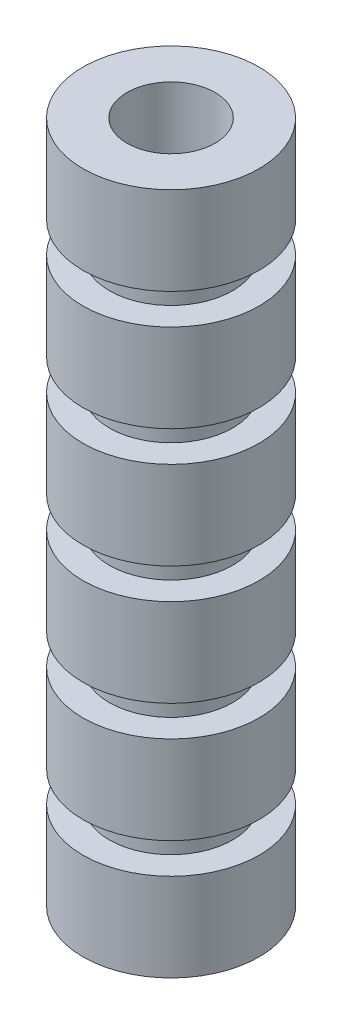
ISO-10303-21;
HEADER;
FILE_DESCRIPTION(('STEP AP214'),'2;1');
FILE_NAME('part.step','',(''),(''),'','','');
FILE_SCHEMA(('AUTOMOTIVE_DESIGN { 1 0 10303 214 1 1 1 1 }'));
ENDSEC;
DATA;
#1=APPLICATION_CONTEXT('core data for automotive mechanical design processes');
#2=APPLICATION_PROTOCOL_DEFINITION('international standard','automotive_design',2000,#1);
#3=PRODUCT_CONTEXT('',#1,'mechanical');
#4=PRODUCT('Part','Part','',(#3));
#5=PRODUCT_RELATED_PRODUCT_CATEGORY('part','',(#4));
#6=PRODUCT_DEFINITION_FORMATION('','',#4);
#7=PRODUCT_DEFINITION_CONTEXT('part definition',#1,'design');
#8=PRODUCT_DEFINITION('design','',#6,#7);
#9=PRODUCT_DEFINITION_SHAPE('','',#8);
#10=(LENGTH_UNIT() NAMED_UNIT(*) SI_UNIT(.MILLI.,.METRE.));
#11=(NAMED_UNIT(*) PLANE_ANGLE_UNIT() SI_UNIT($,.RADIAN.));
#12=(NAMED_UNIT(*) SI_UNIT($,.STERADIAN.) SOLID_ANGLE_UNIT());
#13=UNCERTAINTY_MEASURE_WITH_UNIT(LENGTH_MEASURE(1.E-05),#10,'distance_accuracy_value','');
#14=(GEOMETRIC_REPRESENTATION_CONTEXT(3) GLOBAL_UNCERTAINTY_ASSIGNED_CONTEXT((#13)) GLOBAL_UNIT_ASSIGNED_CONTEXT((#10,
#11,#12)) REPRESENTATION_CONTEXT('',''));
#15=CARTESIAN_POINT('',(0.,0.,0.));
#16=DIRECTION('',(0.,0.,1.));
#17=DIRECTION('',(1.,0.,0.));
#18=AXIS2_PLACEMENT_3D('',#15,#16,#17);
#19=CARTESIAN_POINT('',(0.,64.,0.));
#20=DIRECTION('',(0.,1.,0.));
#21=DIRECTION('',(0.,0.,1.));
#22=AXIS2_PLACEMENT_3D('',#19,#20,#21);
#23=PLANE('',#22);
#24=CARTESIAN_POINT('',(0.,64.,0.));
#25=DIRECTION('',(0.,1.,0.));
#26=DIRECTION('',(0.,0.,1.));
#27=AXIS2_PLACEMENT_3D('',#24,#25,#26);
#28=CIRCLE('',#27,10.);
#29=CARTESIAN_POINT('',(0.,64.,10.));
#30=VERTEX_POINT('',#29);
#31=EDGE_CURVE('E120',#30,#30,#28,.T.);
#32=ORIENTED_EDGE('',*,*,#31,.T.);
#33=EDGE_LOOP('',(#32));
#34=FACE_BOUND('',#33,.T.);
#35=CARTESIAN_POINT('',(0.,64.,0.));
#36=DIRECTION('',(0.,1.,0.));
#37=DIRECTION('',(0.,0.,1.));
#38=AXIS2_PLACEMENT_3D('',#35,#36,#37);
#39=CIRCLE('',#38,7.);
#40=CARTESIAN_POINT('',(0.,64.,7.));
#41=VERTEX_POINT('',#40);
#42=EDGE_CURVE('E132',#41,#41,#39,.T.);
#43=ORIENTED_EDGE('',*,*,#42,.F.);
#44=EDGE_LOOP('',(#43));
#45=FACE_BOUND('',#44,.T.);
#46=ADVANCED_FACE('F49',(#34,#45),#23,.T.);
#47=CARTESIAN_POINT('',(0.,50.5,0.));
#48=DIRECTION('',(0.,1.,0.));
#49=DIRECTION('',(0.,0.,1.));
#50=AXIS2_PLACEMENT_3D('',#47,#48,#49);
#51=PLANE('',#50);
#52=CARTESIAN_POINT('',(0.,50.5,0.));
#53=DIRECTION('',(0.,1.,0.));
#54=DIRECTION('',(0.,0.,1.));
#55=AXIS2_PLACEMENT_3D('',#52,#53,#54);
#56=CIRCLE('',#55,10.);
#57=CARTESIAN_POINT('',(0.,50.5,10.));
#58=VERTEX_POINT('',#57);
#59=EDGE_CURVE('E104',#58,#58,#56,.T.);
#60=ORIENTED_EDGE('',*,*,#59,.T.);
#61=EDGE_LOOP('',(#60));
#62=FACE_BOUND('',#61,.T.);
#63=CARTESIAN_POINT('',(0.,50.5,0.));
#64=DIRECTION('',(0.,1.,0.));
#65=DIRECTION('',(0.,0.,1.));
#66=AXIS2_PLACEMENT_3D('',#63,#64,#65);
#67=CIRCLE('',#66,7.);
#68=CARTESIAN_POINT('',(0.,50.5,7.));
#69=VERTEX_POINT('',#68);
#70=EDGE_CURVE('E116',#69,#69,#67,.T.);
#71=ORIENTED_EDGE('',*,*,#70,.F.);
#72=EDGE_LOOP('',(#71));
#73=FACE_BOUND('',#72,.T.);
#74=ADVANCED_FACE('F172',(#62,#73),#51,.T.);
#75=CARTESIAN_POINT('',(0.,37.,0.));
#76=DIRECTION('',(0.,1.,0.));
#77=DIRECTION('',(0.,0.,1.));
#78=AXIS2_PLACEMENT_3D('',#75,#76,#77);
#79=PLANE('',#78);
#80=CARTESIAN_POINT('',(0.,37.,0.));
#81=DIRECTION('',(0.,1.,0.));
#82=DIRECTION('',(0.,0.,1.));
#83=AXIS2_PLACEMENT_3D('',#80,#81,#82);
#84=CIRCLE('',#83,10.);
#85=CARTESIAN_POINT('',(0.,37.,10.));
#86=VERTEX_POINT('',#85);
#87=EDGE_CURVE('E88',#86,#86,#84,.T.);
#88=ORIENTED_EDGE('',*,*,#87,.T.);
#89=EDGE_LOOP('',(#88));
#90=FACE_BOUND('',#89,.T.);
#91=CARTESIAN_POINT('',(0.,37.,0.));
#92=DIRECTION('',(0.,1.,0.));
#93=DIRECTION('',(0.,0.,1.));
#94=AXIS2_PLACEMENT_3D('',#91,#92,#93);
#95=CIRCLE('',#94,7.);
#96=CARTESIAN_POINT('',(0.,37.,7.));
#97=VERTEX_POINT('',#96);
#98=EDGE_CURVE('E100',#97,#97,#95,.T.);
#99=ORIENTED_EDGE('',*,*,#98,.F.);
#100=EDGE_LOOP('',(#99));
#101=FACE_BOUND('',#100,.T.);
#102=ADVANCED_FACE('F179',(#90,#101),#79,.T.);
#103=CARTESIAN_POINT('',(0.,23.5,0.));
#104=DIRECTION('',(0.,1.,0.));
#105=DIRECTION('',(0.,0.,1.));
#106=AXIS2_PLACEMENT_3D('',#103,#104,#105);
#107=PLANE('',#106);
#108=CARTESIAN_POINT('',(0.,23.5,0.));
#109=DIRECTION('',(0.,1.,0.));
#110=DIRECTION('',(0.,0.,1.));
#111=AXIS2_PLACEMENT_3D('',#108,#109,#110);
#112=CIRCLE('',#111,10.);
#113=CARTESIAN_POINT('',(0.,23.5,10.));
#114=VERTEX_POINT('',#113);
#115=EDGE_CURVE('E72',#114,#114,#112,.T.);
#116=ORIENTED_EDGE('',*,*,#115,.T.);
#117=EDGE_LOOP('',(#116));
#118=FACE_BOUND('',#117,.T.);
#119=CARTESIAN_POINT('',(0.,23.5,0.));
#120=DIRECTION('',(0.,1.,0.));
#121=DIRECTION('',(0.,0.,1.));
#122=AXIS2_PLACEMENT_3D('',#119,#120,#121);
#123=CIRCLE('',#122,7.);
#124=CARTESIAN_POINT('',(0.,23.5,7.));
#125=VERTEX_POINT('',#124);
#126=EDGE_CURVE('E84',#125,#125,#123,.T.);
#127=ORIENTED_EDGE('',*,*,#126,.F.);
#128=EDGE_LOOP('',(#127));
#129=FACE_BOUND('',#128,.T.);
#130=ADVANCED_FACE('F211',(#118,#129),#107,.T.);
#131=CARTESIAN_POINT('',(0.,10.,0.));
#132=DIRECTION('',(0.,1.,0.));
#133=DIRECTION('',(0.,0.,1.));
#134=AXIS2_PLACEMENT_3D('',#131,#132,#133);
#135=PLANE('',#134);
#136=CARTESIAN_POINT('',(0.,10.,0.));
#137=DIRECTION('',(0.,1.,0.));
#138=DIRECTION('',(0.,0.,1.));
#139=AXIS2_PLACEMENT_3D('',#136,#137,#138);
#140=CIRCLE('',#139,10.);
#141=CARTESIAN_POINT('',(0.,10.,10.));
#142=VERTEX_POINT('',#141);
#143=EDGE_CURVE('E10',#142,#142,#140,.T.);
#144=ORIENTED_EDGE('',*,*,#143,.T.);
#145=EDGE_LOOP('',(#144));
#146=FACE_BOUND('',#145,.T.);
#147=CARTESIAN_POINT('',(0.,10.,0.));
#148=DIRECTION('',(0.,1.,0.));
#149=DIRECTION('',(0.,0.,1.));
#150=AXIS2_PLACEMENT_3D('',#147,#148,#149);
#151=CIRCLE('',#150,7.);
#152=CARTESIAN_POINT('',(0.,10.,7.));
#153=VERTEX_POINT('',#152);
#154=EDGE_CURVE('E68',#153,#153,#151,.T.);
#155=ORIENTED_EDGE('',*,*,#154,.F.);
#156=EDGE_LOOP('',(#155));
#157=FACE_BOUND('',#156,.T.);
#158=ADVANCED_FACE('F227',(#146,#157),#135,.T.);
#159=CARTESIAN_POINT('',(0.,0.,0.));
#160=DIRECTION('',(0.,1.,0.));
#161=DIRECTION('',(0.,0.,1.));
#162=AXIS2_PLACEMENT_3D('',#159,#160,#161);
#163=PLANE('',#162);
#164=CARTESIAN_POINT('',(0.,0.,0.));
#165=DIRECTION('',(0.,1.,0.));
#166=DIRECTION('',(0.,0.,1.));
#167=AXIS2_PLACEMENT_3D('',#164,#165,#166);
#168=CIRCLE('',#167,10.);
#169=CARTESIAN_POINT('',(0.,0.,10.));
#170=VERTEX_POINT('',#169);
#171=EDGE_CURVE('E53',#170,#170,#168,.T.);
#172=ORIENTED_EDGE('',*,*,#171,.F.);
#173=EDGE_LOOP('',(#172));
#174=FACE_BOUND('',#173,.T.);
#175=CARTESIAN_POINT('',(0.,0.,0.));
#176=DIRECTION('',(0.,1.,0.));
#177=DIRECTION('',(0.,0.,1.));
#178=AXIS2_PLACEMENT_3D('',#175,#176,#177);
#179=CIRCLE('',#178,5.);
#180=CARTESIAN_POINT('',(0.,0.,5.));
#181=VERTEX_POINT('',#180);
#182=EDGE_CURVE('E62',#181,#181,#179,.T.);
#183=ORIENTED_EDGE('',*,*,#182,.T.);
#184=EDGE_LOOP('',(#183));
#185=FACE_BOUND('',#184,.T.);
#186=ADVANCED_FACE('F243',(#174,#185),#163,.F.);
#187=CARTESIAN_POINT('',(0.,10.,0.));
#188=DIRECTION('',(0.,-1.,0.));
#189=DIRECTION('',(0.,0.,-1.));
#190=AXIS2_PLACEMENT_3D('',#187,#188,#189);
#191=CYLINDRICAL_SURFACE('',#190,10.);
#192=ORIENTED_EDGE('',*,*,#143,.F.);
#193=EDGE_LOOP('',(#192));
#194=FACE_BOUND('',#193,.T.);
#195=ORIENTED_EDGE('',*,*,#171,.T.);
#196=EDGE_LOOP('',(#195));
#197=FACE_BOUND('',#196,.T.);
#198=ADVANCED_FACE('F51',(#194,#197),#191,.T.);
#199=CARTESIAN_POINT('',(0.,10.,0.));
#200=DIRECTION('',(0.,-1.,0.));
#201=DIRECTION('',(0.,0.,-1.));
#202=AXIS2_PLACEMENT_3D('',#199,#200,#201);
#203=CYLINDRICAL_SURFACE('',#202,5.);
#204=ORIENTED_EDGE('',*,*,#182,.F.);
#205=EDGE_LOOP('',(#204));
#206=FACE_BOUND('',#205,.T.);
#207=CARTESIAN_POINT('',(0.,77.5,0.));
#208=DIRECTION('',(0.,1.,0.));
#209=DIRECTION('',(0.,0.,1.));
#210=AXIS2_PLACEMENT_3D('',#207,#208,#209);
#211=CIRCLE('',#210,5.);
#212=CARTESIAN_POINT('',(0.,77.5,5.));
#213=VERTEX_POINT('',#212);
#214=EDGE_CURVE('E144',#213,#213,#211,.T.);
#215=ORIENTED_EDGE('',*,*,#214,.T.);
#216=EDGE_LOOP('',(#215));
#217=FACE_BOUND('',#216,.T.);
#218=ADVANCED_FACE('F152',(#206,#217),#203,.F.);
#219=CARTESIAN_POINT('',(0.,13.5,0.));
#220=DIRECTION('',(0.,-1.,0.));
#221=DIRECTION('',(0.,0.,-1.));
#222=AXIS2_PLACEMENT_3D('',#219,#220,#221);
#223=CYLINDRICAL_SURFACE('',#222,7.);
#224=CARTESIAN_POINT('',(0.,13.5,0.));
#225=DIRECTION('',(0.,1.,0.));
#226=DIRECTION('',(0.,0.,1.));
#227=AXIS2_PLACEMENT_3D('',#224,#225,#226);
#228=CIRCLE('',#227,7.);
#229=CARTESIAN_POINT('',(0.,13.5,7.));
#230=VERTEX_POINT('',#229);
#231=EDGE_CURVE('E67',#230,#230,#228,.T.);
#232=ORIENTED_EDGE('',*,*,#231,.F.);
#233=EDGE_LOOP('',(#232));
#234=FACE_BOUND('',#233,.T.);
#235=ORIENTED_EDGE('',*,*,#154,.T.);
#236=EDGE_LOOP('',(#235));
#237=FACE_BOUND('',#236,.T.);
#238=ADVANCED_FACE('F232',(#234,#237),#223,.T.);
#239=CARTESIAN_POINT('',(0.,13.5,0.));
#240=DIRECTION('',(0.,1.,0.));
#241=DIRECTION('',(0.,0.,1.));
#242=AXIS2_PLACEMENT_3D('',#239,#240,#241);
#243=PLANE('',#242);
#244=ORIENTED_EDGE('',*,*,#231,.T.);
#245=EDGE_LOOP('',(#244));
#246=FACE_BOUND('',#245,.T.);
#247=CARTESIAN_POINT('',(0.,13.5,0.));
#248=DIRECTION('',(0.,1.,0.));
#249=DIRECTION('',(0.,0.,1.));
#250=AXIS2_PLACEMENT_3D('',#247,#248,#249);
#251=CIRCLE('',#250,10.);
#252=CARTESIAN_POINT('',(0.,13.5,10.));
#253=VERTEX_POINT('',#252);
#254=EDGE_CURVE('E76',#253,#253,#251,.T.);
#255=ORIENTED_EDGE('',*,*,#254,.F.);
#256=EDGE_LOOP('',(#255));
#257=FACE_BOUND('',#256,.T.);
#258=ADVANCED_FACE('F229',(#246,#257),#243,.F.);
#259=CARTESIAN_POINT('',(0.,23.5,0.));
#260=DIRECTION('',(0.,-1.,0.));
#261=DIRECTION('',(0.,0.,-1.));
#262=AXIS2_PLACEMENT_3D('',#259,#260,#261);
#263=CYLINDRICAL_SURFACE('',#262,10.);
#264=ORIENTED_EDGE('',*,*,#115,.F.);
#265=EDGE_LOOP('',(#264));
#266=FACE_BOUND('',#265,.T.);
#267=ORIENTED_EDGE('',*,*,#254,.T.);
#268=EDGE_LOOP('',(#267));
#269=FACE_BOUND('',#268,.T.);
#270=ADVANCED_FACE('F223',(#266,#269),#263,.T.);
#271=CARTESIAN_POINT('',(0.,27.,0.));
#272=DIRECTION('',(0.,-1.,0.));
#273=DIRECTION('',(0.,0.,-1.));
#274=AXIS2_PLACEMENT_3D('',#271,#272,#273);
#275=CYLINDRICAL_SURFACE('',#274,7.);
#276=CARTESIAN_POINT('',(0.,27.,0.));
#277=DIRECTION('',(0.,1.,0.));
#278=DIRECTION('',(0.,0.,1.));
#279=AXIS2_PLACEMENT_3D('',#276,#277,#278);
#280=CIRCLE('',#279,7.);
#281=CARTESIAN_POINT('',(0.,27.,7.));
#282=VERTEX_POINT('',#281);
#283=EDGE_CURVE('E80',#282,#282,#280,.T.);
#284=ORIENTED_EDGE('',*,*,#283,.F.);
#285=EDGE_LOOP('',(#284));
#286=FACE_BOUND('',#285,.T.);
#287=ORIENTED_EDGE('',*,*,#126,.T.);
#288=EDGE_LOOP('',(#287));
#289=FACE_BOUND('',#288,.T.);
#290=ADVANCED_FACE('F216',(#286,#289),#275,.T.);
#291=CARTESIAN_POINT('',(0.,27.,0.));
#292=DIRECTION('',(0.,1.,0.));
#293=DIRECTION('',(0.,0.,1.));
#294=AXIS2_PLACEMENT_3D('',#291,#292,#293);
#295=PLANE('',#294);
#296=ORIENTED_EDGE('',*,*,#283,.T.);
#297=EDGE_LOOP('',(#296));
#298=FACE_BOUND('',#297,.T.);
#299=CARTESIAN_POINT('',(0.,27.,0.));
#300=DIRECTION('',(0.,1.,0.));
#301=DIRECTION('',(0.,0.,1.));
#302=AXIS2_PLACEMENT_3D('',#299,#300,#301);
#303=CIRCLE('',#302,10.);
#304=CARTESIAN_POINT('',(0.,27.,10.));
#305=VERTEX_POINT('',#304);
#306=EDGE_CURVE('E92',#305,#305,#303,.T.);
#307=ORIENTED_EDGE('',*,*,#306,.F.);
#308=EDGE_LOOP('',(#307));
#309=FACE_BOUND('',#308,.T.);
#310=ADVANCED_FACE('F213',(#298,#309),#295,.F.);
#311=CARTESIAN_POINT('',(0.,37.,0.));
#312=DIRECTION('',(0.,-1.,0.));
#313=DIRECTION('',(0.,0.,-1.));
#314=AXIS2_PLACEMENT_3D('',#311,#312,#313);
#315=CYLINDRICAL_SURFACE('',#314,10.);
#316=ORIENTED_EDGE('',*,*,#87,.F.);
#317=EDGE_LOOP('',(#316));
#318=FACE_BOUND('',#317,.T.);
#319=ORIENTED_EDGE('',*,*,#306,.T.);
#320=EDGE_LOOP('',(#319));
#321=FACE_BOUND('',#320,.T.);
#322=ADVANCED_FACE('F207',(#318,#321),#315,.T.);
#323=CARTESIAN_POINT('',(0.,40.5,0.));
#324=DIRECTION('',(0.,-1.,0.));
#325=DIRECTION('',(0.,0.,-1.));
#326=AXIS2_PLACEMENT_3D('',#323,#324,#325);
#327=CYLINDRICAL_SURFACE('',#326,7.);
#328=CARTESIAN_POINT('',(0.,40.5,0.));
#329=DIRECTION('',(0.,1.,0.));
#330=DIRECTION('',(0.,0.,1.));
#331=AXIS2_PLACEMENT_3D('',#328,#329,#330);
#332=CIRCLE('',#331,7.);
#333=CARTESIAN_POINT('',(0.,40.5,7.));
#334=VERTEX_POINT('',#333);
#335=EDGE_CURVE('E96',#334,#334,#332,.T.);
#336=ORIENTED_EDGE('',*,*,#335,.F.);
#337=EDGE_LOOP('',(#336));
#338=FACE_BOUND('',#337,.T.);
#339=ORIENTED_EDGE('',*,*,#98,.T.);
#340=EDGE_LOOP('',(#339));
#341=FACE_BOUND('',#340,.T.);
#342=ADVANCED_FACE('F200',(#338,#341),#327,.T.);
#343=CARTESIAN_POINT('',(0.,40.5,0.));
#344=DIRECTION('',(0.,1.,0.));
#345=DIRECTION('',(0.,0.,1.));
#346=AXIS2_PLACEMENT_3D('',#343,#344,#345);
#347=PLANE('',#346);
#348=ORIENTED_EDGE('',*,*,#335,.T.);
#349=EDGE_LOOP('',(#348));
#350=FACE_BOUND('',#349,.T.);
#351=CARTESIAN_POINT('',(0.,40.5,0.));
#352=DIRECTION('',(0.,1.,0.));
#353=DIRECTION('',(0.,0.,1.));
#354=AXIS2_PLACEMENT_3D('',#351,#352,#353);
#355=CIRCLE('',#354,10.);
#356=CARTESIAN_POINT('',(0.,40.5,10.));
#357=VERTEX_POINT('',#356);
#358=EDGE_CURVE('E108',#357,#357,#355,.T.);
#359=ORIENTED_EDGE('',*,*,#358,.F.);
#360=EDGE_LOOP('',(#359));
#361=FACE_BOUND('',#360,.T.);
#362=ADVANCED_FACE('F197',(#350,#361),#347,.F.);
#363=CARTESIAN_POINT('',(0.,50.5,0.));
#364=DIRECTION('',(0.,-1.,0.));
#365=DIRECTION('',(0.,0.,-1.));
#366=AXIS2_PLACEMENT_3D('',#363,#364,#365);
#367=CYLINDRICAL_SURFACE('',#366,10.);
#368=ORIENTED_EDGE('',*,*,#59,.F.);
#369=EDGE_LOOP('',(#368));
#370=FACE_BOUND('',#369,.T.);
#371=ORIENTED_EDGE('',*,*,#358,.T.);
#372=EDGE_LOOP('',(#371));
#373=FACE_BOUND('',#372,.T.);
#374=ADVANCED_FACE('F194',(#370,#373),#367,.T.);
#375=CARTESIAN_POINT('',(0.,54.,0.));
#376=DIRECTION('',(0.,-1.,0.));
#377=DIRECTION('',(0.,0.,-1.));
#378=AXIS2_PLACEMENT_3D('',#375,#376,#377);
#379=CYLINDRICAL_SURFACE('',#378,7.);
#380=CARTESIAN_POINT('',(0.,54.,0.));
#381=DIRECTION('',(0.,1.,0.));
#382=DIRECTION('',(0.,0.,1.));
#383=AXIS2_PLACEMENT_3D('',#380,#381,#382);
#384=CIRCLE('',#383,7.);
#385=CARTESIAN_POINT('',(0.,54.,7.));
#386=VERTEX_POINT('',#385);
#387=EDGE_CURVE('E112',#386,#386,#384,.T.);
#388=ORIENTED_EDGE('',*,*,#387,.F.);
#389=EDGE_LOOP('',(#388));
#390=FACE_BOUND('',#389,.T.);
#391=ORIENTED_EDGE('',*,*,#70,.T.);
#392=EDGE_LOOP('',(#391));
#393=FACE_BOUND('',#392,.T.);
#394=ADVANCED_FACE('F188',(#390,#393),#379,.T.);
#395=CARTESIAN_POINT('',(0.,54.,0.));
#396=DIRECTION('',(0.,1.,0.));
#397=DIRECTION('',(0.,0.,1.));
#398=AXIS2_PLACEMENT_3D('',#395,#396,#397);
#399=PLANE('',#398);
#400=ORIENTED_EDGE('',*,*,#387,.T.);
#401=EDGE_LOOP('',(#400));
#402=FACE_BOUND('',#401,.T.);
#403=CARTESIAN_POINT('',(0.,54.,0.));
#404=DIRECTION('',(0.,1.,0.));
#405=DIRECTION('',(0.,0.,1.));
#406=AXIS2_PLACEMENT_3D('',#403,#404,#405);
#407=CIRCLE('',#406,10.);
#408=CARTESIAN_POINT('',(0.,54.,10.));
#409=VERTEX_POINT('',#408);
#410=EDGE_CURVE('E124',#409,#409,#407,.T.);
#411=ORIENTED_EDGE('',*,*,#410,.F.);
#412=EDGE_LOOP('',(#411));
#413=FACE_BOUND('',#412,.T.);
#414=ADVANCED_FACE('F185',(#402,#413),#399,.F.);
#415=CARTESIAN_POINT('',(0.,64.,0.));
#416=DIRECTION('',(0.,-1.,0.));
#417=DIRECTION('',(0.,0.,-1.));
#418=AXIS2_PLACEMENT_3D('',#415,#416,#417);
#419=CYLINDRICAL_SURFACE('',#418,10.);
#420=ORIENTED_EDGE('',*,*,#31,.F.);
#421=EDGE_LOOP('',(#420));
#422=FACE_BOUND('',#421,.T.);
#423=ORIENTED_EDGE('',*,*,#410,.T.);
#424=EDGE_LOOP('',(#423));
#425=FACE_BOUND('',#424,.T.);
#426=ADVANCED_FACE('F168',(#422,#425),#419,.T.);
#427=CARTESIAN_POINT('',(0.,67.5,0.));
#428=DIRECTION('',(0.,-1.,0.));
#429=DIRECTION('',(0.,0.,-1.));
#430=AXIS2_PLACEMENT_3D('',#427,#428,#429);
#431=CYLINDRICAL_SURFACE('',#430,7.);
#432=CARTESIAN_POINT('',(0.,67.5,0.));
#433=DIRECTION('',(0.,1.,0.));
#434=DIRECTION('',(0.,0.,1.));
#435=AXIS2_PLACEMENT_3D('',#432,#433,#434);
#436=CIRCLE('',#435,7.);
#437=CARTESIAN_POINT('',(0.,67.5,7.));
#438=VERTEX_POINT('',#437);
#439=EDGE_CURVE('E128',#438,#438,#436,.T.);
#440=ORIENTED_EDGE('',*,*,#439,.F.);
#441=EDGE_LOOP('',(#440));
#442=FACE_BOUND('',#441,.T.);
#443=ORIENTED_EDGE('',*,*,#42,.T.);
#444=EDGE_LOOP('',(#443));
#445=FACE_BOUND('',#444,.T.);
#446=ADVANCED_FACE('F157',(#442,#445),#431,.T.);
#447=CARTESIAN_POINT('',(0.,77.5,0.));
#448=DIRECTION('',(0.,1.,0.));
#449=DIRECTION('',(0.,0.,1.));
#450=AXIS2_PLACEMENT_3D('',#447,#448,#449);
#451=PLANE('',#450);
#452=CARTESIAN_POINT('',(0.,77.5,0.));
#453=DIRECTION('',(0.,1.,0.));
#454=DIRECTION('',(0.,0.,1.));
#455=AXIS2_PLACEMENT_3D('',#452,#453,#454);
#456=CIRCLE('',#455,10.);
#457=CARTESIAN_POINT('',(0.,77.5,10.));
#458=VERTEX_POINT('',#457);
#459=EDGE_CURVE('E136',#458,#458,#456,.T.);
#460=ORIENTED_EDGE('',*,*,#459,.T.);
#461=EDGE_LOOP('',(#460));
#462=FACE_BOUND('',#461,.T.);
#463=ORIENTED_EDGE('',*,*,#214,.F.);
#464=EDGE_LOOP('',(#463));
#465=FACE_BOUND('',#464,.T.);
#466=ADVANCED_FACE('F154',(#462,#465),#451,.T.);
#467=CARTESIAN_POINT('',(0.,67.5,0.));
#468=DIRECTION('',(0.,1.,0.));
#469=DIRECTION('',(0.,0.,1.));
#470=AXIS2_PLACEMENT_3D('',#467,#468,#469);
#471=PLANE('',#470);
#472=ORIENTED_EDGE('',*,*,#439,.T.);
#473=EDGE_LOOP('',(#472));
#474=FACE_BOUND('',#473,.T.);
#475=CARTESIAN_POINT('',(0.,67.5,0.));
#476=DIRECTION('',(0.,1.,0.));
#477=DIRECTION('',(0.,0.,1.));
#478=AXIS2_PLACEMENT_3D('',#475,#476,#477);
#479=CIRCLE('',#478,10.);
#480=CARTESIAN_POINT('',(0.,67.5,10.));
#481=VERTEX_POINT('',#480);
#482=EDGE_CURVE('E140',#481,#481,#479,.T.);
#483=ORIENTED_EDGE('',*,*,#482,.F.);
#484=EDGE_LOOP('',(#483));
#485=FACE_BOUND('',#484,.T.);
#486=ADVANCED_FACE('F156',(#474,#485),#471,.F.);
#487=CARTESIAN_POINT('',(0.,77.5,0.));
#488=DIRECTION('',(0.,-1.,0.));
#489=DIRECTION('',(0.,0.,-1.));
#490=AXIS2_PLACEMENT_3D('',#487,#488,#489);
#491=CYLINDRICAL_SURFACE('',#490,10.);
#492=ORIENTED_EDGE('',*,*,#459,.F.);
#493=EDGE_LOOP('',(#492));
#494=FACE_BOUND('',#493,.T.);
#495=ORIENTED_EDGE('',*,*,#482,.T.);
#496=EDGE_LOOP('',(#495));
#497=FACE_BOUND('',#496,.T.);
#498=ADVANCED_FACE('F164',(#494,#497),#491,.T.);
#499=CLOSED_SHELL('',(#46,#74,#102,#130,#158,#186,#198,#218,#238,#258,#270,#290,#310,#322,#342,
#362,#374,#394,#414,#426,#446,#466,#486,#498));
#500=MANIFOLD_SOLID_BREP('B2',#499);
#501=ADVANCED_BREP_SHAPE_REPRESENTATION('',(#18,#500),#14);
#502=SHAPE_DEFINITION_REPRESENTATION(#9,#501);
ENDSEC;
END-ISO-10303-21;
